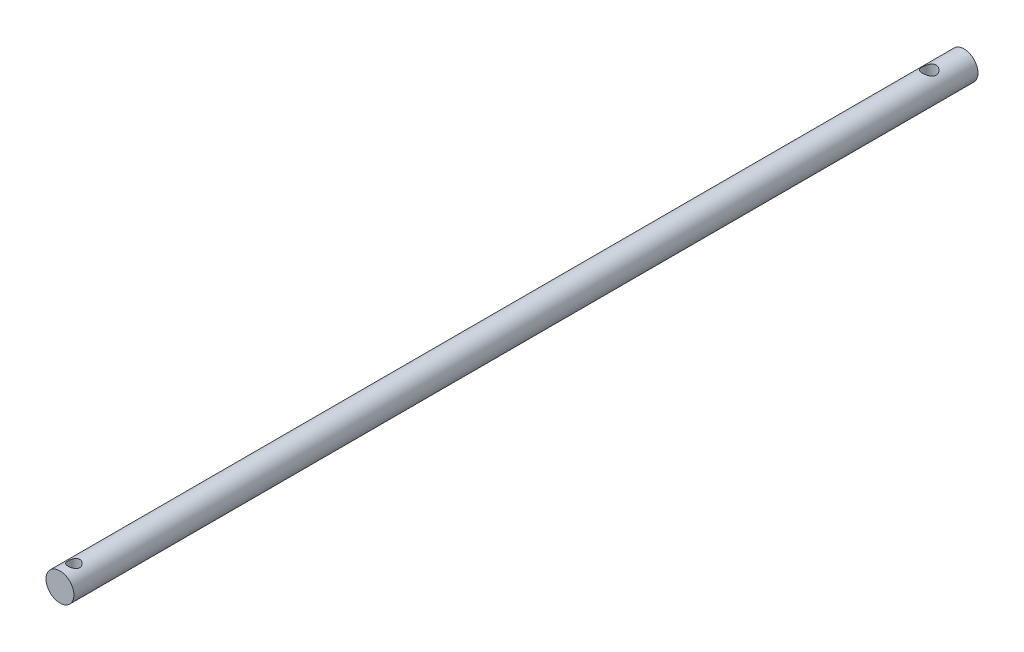
ISO-10303-21;
HEADER;
FILE_DESCRIPTION(('STEP AP214'),'2;1');
FILE_NAME('part.step','',(''),(''),'','','');
FILE_SCHEMA(('AUTOMOTIVE_DESIGN { 1 0 10303 214 1 1 1 1 }'));
ENDSEC;
DATA;
#1=APPLICATION_CONTEXT('core data for automotive mechanical design processes');
#2=APPLICATION_PROTOCOL_DEFINITION('international standard','automotive_design',2000,#1);
#3=PRODUCT_CONTEXT('',#1,'mechanical');
#4=PRODUCT('Part','Part','',(#3));
#5=PRODUCT_RELATED_PRODUCT_CATEGORY('part','',(#4));
#6=PRODUCT_DEFINITION_FORMATION('','',#4);
#7=PRODUCT_DEFINITION_CONTEXT('part definition',#1,'design');
#8=PRODUCT_DEFINITION('design','',#6,#7);
#9=PRODUCT_DEFINITION_SHAPE('','',#8);
#10=(LENGTH_UNIT() NAMED_UNIT(*) SI_UNIT(.MILLI.,.METRE.));
#11=(NAMED_UNIT(*) PLANE_ANGLE_UNIT() SI_UNIT($,.RADIAN.));
#12=(NAMED_UNIT(*) SI_UNIT($,.STERADIAN.) SOLID_ANGLE_UNIT());
#13=UNCERTAINTY_MEASURE_WITH_UNIT(LENGTH_MEASURE(1.E-05),#10,'distance_accuracy_value','');
#14=(GEOMETRIC_REPRESENTATION_CONTEXT(3) GLOBAL_UNCERTAINTY_ASSIGNED_CONTEXT((#13)) GLOBAL_UNIT_ASSIGNED_CONTEXT((#10,
#11,#12)) REPRESENTATION_CONTEXT('',''));
#15=CARTESIAN_POINT('',(0.,0.,0.));
#16=DIRECTION('',(0.,0.,1.));
#17=DIRECTION('',(1.,0.,0.));
#18=AXIS2_PLACEMENT_3D('',#15,#16,#17);
#19=CARTESIAN_POINT('',(0.,0.,259.));
#20=DIRECTION('',(0.,0.,-1.));
#21=DIRECTION('',(-1.,0.,0.));
#22=AXIS2_PLACEMENT_3D('',#19,#20,#21);
#23=CYLINDRICAL_SURFACE('',#22,4.);
#24=CARTESIAN_POINT('',(0.,-4.,256.69));
#25=CARTESIAN_POINT('',(0.0904187977378534,-3.99999236748301,256.689989901106));
#26=CARTESIAN_POINT('',(0.180974137610618,-3.99689882603683,256.682700725231));
#27=CARTESIAN_POINT('',(0.359513324239295,-3.98482238752453,256.653805453171));
#28=CARTESIAN_POINT('',(0.447489957864808,-3.97582436309426,256.632162581101));
#29=CARTESIAN_POINT('',(0.617994430443012,-3.95290460936051,256.575506843788));
#30=CARTESIAN_POINT('',(0.700539814947884,-3.93899976235193,256.54053978889));
#31=CARTESIAN_POINT('',(0.858511149356958,-3.90761479968936,256.458420045241));
#32=CARTESIAN_POINT('',(0.933939135949763,-3.89013571138923,256.411270857009));
#33=CARTESIAN_POINT('',(1.07952774502228,-3.85234213214195,256.303571367521));
#34=CARTESIAN_POINT('',(1.14927531816145,-3.83193309851281,256.242496192746));
#35=CARTESIAN_POINT('',(1.27789469821147,-3.79098272951728,256.109789019115));
#36=CARTESIAN_POINT('',(1.33676062828834,-3.77044132882458,256.038151353113));
#37=CARTESIAN_POINT('',(1.44491079202456,-3.73037948410023,255.881933511229));
#38=CARTESIAN_POINT('',(1.49355448088583,-3.71096429077667,255.796880042952));
#39=CARTESIAN_POINT('',(1.57566032710226,-3.67685815218386,255.618860214084));
#40=CARTESIAN_POINT('',(1.60913052242907,-3.66216470683064,255.525898074086));
#41=CARTESIAN_POINT('',(1.65822137924007,-3.64019193551198,255.339454704516));
#42=CARTESIAN_POINT('',(1.67463822731531,-3.63258380882292,255.246223384325));
#43=CARTESIAN_POINT('',(1.6916389519161,-3.62470066552943,255.058042889895));
#44=CARTESIAN_POINT('',(1.69223191766067,-3.62442143921493,254.963094733172));
#45=CARTESIAN_POINT('',(1.67816648000947,-3.63095018056392,254.782211572006));
#46=CARTESIAN_POINT('',(1.66471292395005,-3.63719828804049,254.696158563454));
#47=CARTESIAN_POINT('',(1.62496162231372,-3.65512928265603,254.527670462541));
#48=CARTESIAN_POINT('',(1.59866133438611,-3.66681324552159,254.445236089825));
#49=CARTESIAN_POINT('',(1.53344740790441,-3.69456536442449,254.28421346331));
#50=CARTESIAN_POINT('',(1.49427409346329,-3.71072259813572,254.205746422577));
#51=CARTESIAN_POINT('',(1.40461025505431,-3.74558141462285,254.056188693971));
#52=CARTESIAN_POINT('',(1.35411519868848,-3.76428401519589,253.985100976958));
#53=CARTESIAN_POINT('',(1.23807868093097,-3.80410788012475,253.845800653125));
#54=CARTESIAN_POINT('',(1.17160958067256,-3.825297901223,253.778378191928));
#55=CARTESIAN_POINT('',(1.02810403715588,-3.86633781546774,253.655367728628));
#56=CARTESIAN_POINT('',(0.951064985939224,-3.88618737606883,253.599782655868));
#57=CARTESIAN_POINT('',(0.786147490487138,-3.92291605594621,253.500821226993));
#58=CARTESIAN_POINT('',(0.69805086001977,-3.9397111172698,253.457774953376));
#59=CARTESIAN_POINT('',(0.514975339328132,-3.96778959195378,253.387392649354));
#60=CARTESIAN_POINT('',(0.420000397501675,-3.97907613904824,253.360047685078));
#61=CARTESIAN_POINT('',(0.232459958250167,-3.99427537725437,253.323518099692));
#62=CARTESIAN_POINT('',(0.140135702281223,-3.99861764618435,253.313273626046));
#63=CARTESIAN_POINT('',(-0.0450077112308784,-4.00081675074519,253.308065297569));
#64=CARTESIAN_POINT('',(-0.137826713349778,-3.99867551564121,253.313096897111));
#65=CARTESIAN_POINT('',(-0.316304079999673,-3.98842570699486,253.33754690452));
#66=CARTESIAN_POINT('',(-0.402085422974631,-3.98062913203958,253.356213451676));
#67=CARTESIAN_POINT('',(-0.569200242421756,-3.9601897273826,253.406348648216));
#68=CARTESIAN_POINT('',(-0.650533159504975,-3.94754628978231,253.437818903485));
#69=CARTESIAN_POINT('',(-0.809306683760339,-3.91813067285639,253.51369375295));
#70=CARTESIAN_POINT('',(-0.886547008511293,-3.90124210751331,253.55847085978));
#71=CARTESIAN_POINT('',(-1.03269506611376,-3.86512833606225,253.659280074284));
#72=CARTESIAN_POINT('',(-1.10159925960638,-3.84590214434147,253.715316935949));
#73=CARTESIAN_POINT('',(-1.23443718760681,-3.80543486846857,253.84186182083));
#74=CARTESIAN_POINT('',(-1.29763513044852,-3.78414945926641,253.913130015415));
#75=CARTESIAN_POINT('',(-1.41138831787397,-3.7432134233303,254.065585255203));
#76=CARTESIAN_POINT('',(-1.46194038421238,-3.72356320839066,254.146774786285));
#77=CARTESIAN_POINT('',(-1.54960079926505,-3.68795624343166,254.318617173841));
#78=CARTESIAN_POINT('',(-1.58648095327107,-3.67206366347157,254.409400729139));
#79=CARTESIAN_POINT('',(-1.64410901959406,-3.64663078257539,254.596774106323));
#80=CARTESIAN_POINT('',(-1.66487074169268,-3.63708504486726,254.693358881283));
#81=CARTESIAN_POINT('',(-1.68828207541125,-3.62627283049224,254.881405037026));
#82=CARTESIAN_POINT('',(-1.69222825892826,-3.62441401780231,254.972671588958));
#83=CARTESIAN_POINT('',(-1.68537785637328,-3.6276047997137,255.1545169765));
#84=CARTESIAN_POINT('',(-1.67458369192035,-3.63265325955354,255.245095922614));
#85=CARTESIAN_POINT('',(-1.63965823769036,-3.64854188176089,255.418394371892));
#86=CARTESIAN_POINT('',(-1.61620934370255,-3.6590848367316,255.501281294741));
#87=CARTESIAN_POINT('',(-1.5573177963736,-3.6845331741648,255.661957929973));
#88=CARTESIAN_POINT('',(-1.52187175339322,-3.69943978936203,255.739746194373));
#89=CARTESIAN_POINT('',(-1.43750296026302,-3.73306367433835,255.893204624675));
#90=CARTESIAN_POINT('',(-1.38788953597361,-3.75195803310328,255.96845551494));
#91=CARTESIAN_POINT('',(-1.27754679821321,-3.79094917474781,256.109969165534));
#92=CARTESIAN_POINT('',(-1.21681345812639,-3.81104639141229,256.17622865482));
#93=CARTESIAN_POINT('',(-1.08049597704433,-3.852007517481,256.303048459568));
#94=CARTESIAN_POINT('',(-1.00413525518049,-3.87281413459316,256.362796514883));
#95=CARTESIAN_POINT('',(-0.84170731443426,-3.91132777067814,256.468681050493));
#96=CARTESIAN_POINT('',(-0.755635712477166,-3.92903338071274,256.514811350071));
#97=CARTESIAN_POINT('',(-0.577463560917082,-3.95911267903729,256.59119066456));
#98=CARTESIAN_POINT('',(-0.485478199081786,-3.97156534053616,256.621676515701));
#99=CARTESIAN_POINT('',(-0.29721045608487,-3.99005502570014,256.66645346392));
#100=CARTESIAN_POINT('',(-0.200942443236266,-3.99611203103567,256.680795009287));
#101=CARTESIAN_POINT('',(-0.0695327137178608,-3.99954937588165,256.688930982124));
#102=CARTESIAN_POINT('',(-0.0347764561266262,-4.00000293558307,256.690003884189));
#103=CARTESIAN_POINT('',(0.,-4.,256.69));
#104=B_SPLINE_CURVE_WITH_KNOTS('',3,(#24,#25,#26,#27,#28,#29,#30,#31,#32,#33,#34,#35,#36,#37,
#38,#39,#40,#41,#42,#43,#44,#45,#46,#47,#48,#49,#50,#51,#52,#53,#54,#55,#56,#57,#58,#59,#60,#61,
#62,#63,#64,#65,#66,#67,#68,#69,#70,#71,#72,#73,#74,#75,#76,#77,#78,#79,#80,#81,#82,#83,#84,#85,
#86,#87,#88,#89,#90,#91,#92,#93,#94,#95,#96,#97,#98,#99,#100,#101,#102,#103),.UNSPECIFIED.,.T.,
.F.,(4,2,2,2,2,2,2,2,2,2,2,2,2,2,2,2,2,2,2,2,2,2,2,2,2,2,2,2,2,2,2,2,2,2,2,2,2,2,2,4),(0.,
0.271155352410752,0.543008135123759,0.813934563447645,1.08478322783958,1.36833684086817,
1.65204314773266,1.95019604386879,2.24819081208455,2.5315445261753,2.81473547872727,
3.07548540746323,3.3362869591733,3.60271042234599,3.86924073303779,4.15899322089027,
4.44881732931355,4.74569559637374,5.04240477516915,5.31993012353291,5.5973728981285,
5.86057213852874,6.12380440045921,6.3952398082215,6.66679006069921,6.95826732215515,
7.24981776617139,7.54603599625316,7.84200015463494,8.11467710807927,8.38730927016069,
8.64652640689924,8.90581684330839,9.18093787353902,9.45615872516712,9.75223361784434,
10.0484426847202,10.3400244401021,10.6306924992217,10.7349830057594),.UNSPECIFIED.);
#105=CARTESIAN_POINT('',(0.,-4.,256.69));
#106=VERTEX_POINT('',#105);
#107=EDGE_CURVE('E11',#106,#106,#104,.T.);
#108=ORIENTED_EDGE('',*,*,#107,.T.);
#109=EDGE_LOOP('',(#108));
#110=FACE_BOUND('',#109,.T.);
#111=CARTESIAN_POINT('',(0.,4.,256.69));
#112=CARTESIAN_POINT('',(-0.0904187977378534,3.99999236748301,256.689989901106));
#113=CARTESIAN_POINT('',(-0.180974137610618,3.99689882603683,256.682700725231));
#114=CARTESIAN_POINT('',(-0.359513324239295,3.98482238752453,256.653805453171));
#115=CARTESIAN_POINT('',(-0.447489957864808,3.97582436309426,256.632162581101));
#116=CARTESIAN_POINT('',(-0.617994430443012,3.95290460936051,256.575506843788));
#117=CARTESIAN_POINT('',(-0.700539814947884,3.93899976235193,256.54053978889));
#118=CARTESIAN_POINT('',(-0.858511149356958,3.90761479968936,256.458420045241));
#119=CARTESIAN_POINT('',(-0.933939135949763,3.89013571138923,256.411270857009));
#120=CARTESIAN_POINT('',(-1.07952774502228,3.85234213214195,256.303571367521));
#121=CARTESIAN_POINT('',(-1.14927531816145,3.83193309851281,256.242496192746));
#122=CARTESIAN_POINT('',(-1.27789469821147,3.79098272951728,256.109789019115));
#123=CARTESIAN_POINT('',(-1.33676062828834,3.77044132882458,256.038151353113));
#124=CARTESIAN_POINT('',(-1.44491079202456,3.73037948410023,255.881933511229));
#125=CARTESIAN_POINT('',(-1.49355448088583,3.71096429077667,255.796880042952));
#126=CARTESIAN_POINT('',(-1.57566032710226,3.67685815218386,255.618860214084));
#127=CARTESIAN_POINT('',(-1.60913052242907,3.66216470683064,255.525898074086));
#128=CARTESIAN_POINT('',(-1.65822137924007,3.64019193551198,255.339454704516));
#129=CARTESIAN_POINT('',(-1.67463822731531,3.63258380882292,255.246223384325));
#130=CARTESIAN_POINT('',(-1.6916389519161,3.62470066552943,255.058042889895));
#131=CARTESIAN_POINT('',(-1.69223191766067,3.62442143921493,254.963094733172));
#132=CARTESIAN_POINT('',(-1.67816648000947,3.63095018056392,254.782211572006));
#133=CARTESIAN_POINT('',(-1.66471292395005,3.63719828804049,254.696158563454));
#134=CARTESIAN_POINT('',(-1.62496162231372,3.65512928265603,254.527670462541));
#135=CARTESIAN_POINT('',(-1.59866133438611,3.66681324552159,254.445236089825));
#136=CARTESIAN_POINT('',(-1.53344740790441,3.69456536442449,254.28421346331));
#137=CARTESIAN_POINT('',(-1.49427409346329,3.71072259813572,254.205746422577));
#138=CARTESIAN_POINT('',(-1.40461025505431,3.74558141462285,254.056188693971));
#139=CARTESIAN_POINT('',(-1.35411519868848,3.76428401519589,253.985100976958));
#140=CARTESIAN_POINT('',(-1.23807868093097,3.80410788012475,253.845800653125));
#141=CARTESIAN_POINT('',(-1.17160958067256,3.825297901223,253.778378191928));
#142=CARTESIAN_POINT('',(-1.02810403715588,3.86633781546774,253.655367728628));
#143=CARTESIAN_POINT('',(-0.951064985939224,3.88618737606883,253.599782655868));
#144=CARTESIAN_POINT('',(-0.786147490487138,3.92291605594621,253.500821226993));
#145=CARTESIAN_POINT('',(-0.69805086001977,3.9397111172698,253.457774953376));
#146=CARTESIAN_POINT('',(-0.514975339328132,3.96778959195378,253.387392649354));
#147=CARTESIAN_POINT('',(-0.420000397501675,3.97907613904824,253.360047685078));
#148=CARTESIAN_POINT('',(-0.232459958250167,3.99427537725437,253.323518099692));
#149=CARTESIAN_POINT('',(-0.140135702281223,3.99861764618435,253.313273626046));
#150=CARTESIAN_POINT('',(0.0450077112308784,4.00081675074519,253.308065297569));
#151=CARTESIAN_POINT('',(0.137826713349778,3.99867551564121,253.313096897111));
#152=CARTESIAN_POINT('',(0.316304079999673,3.98842570699486,253.33754690452));
#153=CARTESIAN_POINT('',(0.402085422974631,3.98062913203958,253.356213451676));
#154=CARTESIAN_POINT('',(0.569200242421756,3.9601897273826,253.406348648216));
#155=CARTESIAN_POINT('',(0.650533159504975,3.94754628978231,253.437818903485));
#156=CARTESIAN_POINT('',(0.809306683760339,3.91813067285639,253.51369375295));
#157=CARTESIAN_POINT('',(0.886547008511293,3.90124210751331,253.55847085978));
#158=CARTESIAN_POINT('',(1.03269506611376,3.86512833606225,253.659280074284));
#159=CARTESIAN_POINT('',(1.10159925960638,3.84590214434147,253.715316935949));
#160=CARTESIAN_POINT('',(1.23443718760681,3.80543486846857,253.84186182083));
#161=CARTESIAN_POINT('',(1.29763513044852,3.78414945926641,253.913130015415));
#162=CARTESIAN_POINT('',(1.41138831787397,3.7432134233303,254.065585255203));
#163=CARTESIAN_POINT('',(1.46194038421238,3.72356320839066,254.146774786285));
#164=CARTESIAN_POINT('',(1.54960079926505,3.68795624343166,254.318617173841));
#165=CARTESIAN_POINT('',(1.58648095327107,3.67206366347157,254.409400729139));
#166=CARTESIAN_POINT('',(1.64410901959406,3.64663078257539,254.596774106323));
#167=CARTESIAN_POINT('',(1.66487074169268,3.63708504486726,254.693358881283));
#168=CARTESIAN_POINT('',(1.68828207541125,3.62627283049224,254.881405037026));
#169=CARTESIAN_POINT('',(1.69222825892826,3.62441401780231,254.972671588958));
#170=CARTESIAN_POINT('',(1.68537785637328,3.6276047997137,255.1545169765));
#171=CARTESIAN_POINT('',(1.67458369192035,3.63265325955354,255.245095922614));
#172=CARTESIAN_POINT('',(1.63965823769036,3.64854188176089,255.418394371892));
#173=CARTESIAN_POINT('',(1.61620934370255,3.6590848367316,255.501281294741));
#174=CARTESIAN_POINT('',(1.5573177963736,3.6845331741648,255.661957929973));
#175=CARTESIAN_POINT('',(1.52187175339322,3.69943978936203,255.739746194373));
#176=CARTESIAN_POINT('',(1.43750296026302,3.73306367433835,255.893204624675));
#177=CARTESIAN_POINT('',(1.38788953597361,3.75195803310328,255.96845551494));
#178=CARTESIAN_POINT('',(1.27754679821321,3.79094917474781,256.109969165534));
#179=CARTESIAN_POINT('',(1.21681345812639,3.81104639141229,256.17622865482));
#180=CARTESIAN_POINT('',(1.08049597704433,3.852007517481,256.303048459568));
#181=CARTESIAN_POINT('',(1.00413525518049,3.87281413459316,256.362796514883));
#182=CARTESIAN_POINT('',(0.84170731443426,3.91132777067814,256.468681050493));
#183=CARTESIAN_POINT('',(0.755635712477166,3.92903338071274,256.514811350071));
#184=CARTESIAN_POINT('',(0.577463560917082,3.95911267903729,256.59119066456));
#185=CARTESIAN_POINT('',(0.485478199081786,3.97156534053616,256.621676515701));
#186=CARTESIAN_POINT('',(0.29721045608487,3.99005502570014,256.66645346392));
#187=CARTESIAN_POINT('',(0.200942443236266,3.99611203103567,256.680795009287));
#188=CARTESIAN_POINT('',(0.0695327137178608,3.99954937588165,256.688930982124));
#189=CARTESIAN_POINT('',(0.0347764561266262,4.00000293558307,256.690003884189));
#190=CARTESIAN_POINT('',(0.,4.,256.69));
#191=B_SPLINE_CURVE_WITH_KNOTS('',3,(#111,#112,#113,#114,#115,#116,#117,#118,#119,#120,#121,
#122,#123,#124,#125,#126,#127,#128,#129,#130,#131,#132,#133,#134,#135,#136,#137,#138,#139,#140,
#141,#142,#143,#144,#145,#146,#147,#148,#149,#150,#151,#152,#153,#154,#155,#156,#157,#158,#159,
#160,#161,#162,#163,#164,#165,#166,#167,#168,#169,#170,#171,#172,#173,#174,#175,#176,#177,#178,
#179,#180,#181,#182,#183,#184,#185,#186,#187,#188,#189,#190),.UNSPECIFIED.,.T.,.F.,(4,2,2,2,2,2,
2,2,2,2,2,2,2,2,2,2,2,2,2,2,2,2,2,2,2,2,2,2,2,2,2,2,2,2,2,2,2,2,2,4),(0.,0.271155352410752,
0.543008135123759,0.813934563447645,1.08478322783958,1.36833684086817,1.65204314773266,
1.95019604386879,2.24819081208455,2.5315445261753,2.81473547872727,3.07548540746323,
3.3362869591733,3.60271042234599,3.86924073303779,4.15899322089027,4.44881732931355,
4.74569559637374,5.04240477516915,5.31993012353291,5.5973728981285,5.86057213852874,
6.12380440045921,6.3952398082215,6.66679006069921,6.95826732215515,7.24981776617139,
7.54603599625316,7.84200015463494,8.11467710807927,8.38730927016069,8.64652640689924,
8.90581684330839,9.18093787353902,9.45615872516712,9.75223361784434,10.0484426847202,
10.3400244401021,10.6306924992217,10.7349830057594),.UNSPECIFIED.);
#192=CARTESIAN_POINT('',(0.,4.,256.69));
#193=VERTEX_POINT('',#192);
#194=EDGE_CURVE('E40',#193,#193,#191,.T.);
#195=ORIENTED_EDGE('',*,*,#194,.T.);
#196=EDGE_LOOP('',(#195));
#197=FACE_BOUND('',#196,.T.);
#198=CARTESIAN_POINT('',(0.,4.,12.));
#199=CARTESIAN_POINT('',(-0.105143925902467,3.99999426810082,11.9999933953656));
#200=CARTESIAN_POINT('',(-0.210413199395124,3.99580982039513,11.9916598537579));
#201=CARTESIAN_POINT('',(-0.417840470537791,3.97948312074314,11.9586942393169));
#202=CARTESIAN_POINT('',(-0.519992173427258,3.96732575657839,11.9340312140044));
#203=CARTESIAN_POINT('',(-0.717867089760896,3.93632558806751,11.8696123827667));
#204=CARTESIAN_POINT('',(-0.813613605878291,3.91750878355075,11.8299152315041));
#205=CARTESIAN_POINT('',(-0.996945233613195,3.87491553031523,11.73685875727));
#206=CARTESIAN_POINT('',(-1.08453098798012,3.85113947267051,11.6835005115023));
#207=CARTESIAN_POINT('',(-1.25501563552382,3.79912516516124,11.5609655010294));
#208=CARTESIAN_POINT('',(-1.33731042224421,3.77070398255074,11.4910270415207));
#209=CARTESIAN_POINT('',(-1.48955888973396,3.71319940493486,11.3389570415059));
#210=CARTESIAN_POINT('',(-1.55950316621353,3.68411552418069,11.2568162964551));
#211=CARTESIAN_POINT('',(-1.69050400090055,3.62597902394695,11.0750333009532));
#212=CARTESIAN_POINT('',(-1.75045067110327,3.59710373940264,10.9745278033082));
#213=CARTESIAN_POINT('',(-1.85233645378139,3.54571957544641,10.7632653280276));
#214=CARTESIAN_POINT('',(-1.89428842993266,3.52320615213979,10.6525157425545));
#215=CARTESIAN_POINT('',(-1.95626488437717,3.48915734075617,10.4306697891562));
#216=CARTESIAN_POINT('',(-1.97745171416088,3.47704543167427,10.3199910958652));
#217=CARTESIAN_POINT('',(-2.00085398661769,3.46363779897056,10.096042324441));
#218=CARTESIAN_POINT('',(-2.00308817674614,3.46233138686576,9.98277491825769));
#219=CARTESIAN_POINT('',(-1.98937457434459,3.47021860514497,9.77142795136927));
#220=CARTESIAN_POINT('',(-1.97556911907364,3.47817527324027,9.6731519375539));
#221=CARTESIAN_POINT('',(-1.93387969811386,3.50152457467701,9.48055618125392));
#222=CARTESIAN_POINT('',(-1.9059912477953,3.51691957663553,9.38623770938937));
#223=CARTESIAN_POINT('',(-1.836419560772,3.55374952825482,9.20154173486868));
#224=CARTESIAN_POINT('',(-1.79443013423199,3.57531681327997,9.11130720242842));
#225=CARTESIAN_POINT('',(-1.698083375336,3.62206808562807,8.93873141481999));
#226=CARTESIAN_POINT('',(-1.64372048762493,3.64725369560381,8.85639372879982));
#227=CARTESIAN_POINT('',(-1.51613210982557,3.70226315806572,8.69095749451355));
#228=CARTESIAN_POINT('',(-1.44138891673856,3.73227020473492,8.60908625284769));
#229=CARTESIAN_POINT('',(-1.27911115748274,3.79095246600815,8.4585291628182));
#230=CARTESIAN_POINT('',(-1.19157051314857,3.81962703917602,8.38984961593224));
#231=CARTESIAN_POINT('',(-1.00103301166369,3.87403974565928,8.26462867794055));
#232=CARTESIAN_POINT('',(-0.897507183198815,3.89957968324015,8.20879905510852));
#233=CARTESIAN_POINT('',(-0.680932430977592,3.94315762242485,8.11580594191398));
#234=CARTESIAN_POINT('',(-0.567891152530551,3.96120157887106,8.07862762996967));
#235=CARTESIAN_POINT('',(-0.345532983321405,3.98648667482871,8.02704919256665));
#236=CARTESIAN_POINT('',(-0.236683061096653,3.9944987660262,8.01101752850644));
#237=CARTESIAN_POINT('',(-0.0175591998987037,4.00146026918207,7.99707053773103));
#238=CARTESIAN_POINT('',(0.0927140397398169,4.00041397442637,7.99914662872107));
#239=CARTESIAN_POINT('',(0.302465943971973,3.9898238450687,8.02041337683749));
#240=CARTESIAN_POINT('',(0.402118816099859,3.98094491376337,8.03826506545999));
#241=CARTESIAN_POINT('',(0.596813784603881,3.95644342629681,8.08847614379025));
#242=CARTESIAN_POINT('',(0.691855371382173,3.94082012668824,8.12083713290699));
#243=CARTESIAN_POINT('',(0.877777216899144,3.90368502827176,8.19999693286607));
#244=CARTESIAN_POINT('',(0.968460794011605,3.88201763539262,8.24718210023258));
#245=CARTESIAN_POINT('',(1.14092272339854,3.83487948634835,8.35421507129314));
#246=CARTESIAN_POINT('',(1.22269725955318,3.80940711133877,8.41406826919079));
#247=CARTESIAN_POINT('',(1.38353537857843,3.75416442672396,8.55152085066143));
#248=CARTESIAN_POINT('',(1.46154415563805,3.72421769686998,8.6302857368903));
#249=CARTESIAN_POINT('',(1.60371264223771,3.6652478321764,8.79985030255546));
#250=CARTESIAN_POINT('',(1.66786277142374,3.63622534800094,8.89065823769584));
#251=CARTESIAN_POINT('',(1.78341582895803,3.58102384412979,9.08728730834595));
#252=CARTESIAN_POINT('',(1.83405099160049,3.55505059178122,9.19362253218896));
#253=CARTESIAN_POINT('',(1.9161656518694,3.5114814458827,9.41502013514993));
#254=CARTESIAN_POINT('',(1.94766983173403,3.493874764435,9.53007105293378));
#255=CARTESIAN_POINT('',(1.98772337493374,3.47123002051604,9.75382044576941));
#256=CARTESIAN_POINT('',(1.9981859928109,3.4651476693013,9.86206850687048));
#257=CARTESIAN_POINT('',(2.0013783087524,3.46330709283207,10.078894134329));
#258=CARTESIAN_POINT('',(1.99411569324648,3.4675443925278,10.1874715374757));
#259=CARTESIAN_POINT('',(1.96385225118662,3.48475724102153,10.3909670030669));
#260=CARTESIAN_POINT('',(1.94241662868606,3.49686188965317,10.4862009402895));
#261=CARTESIAN_POINT('',(1.88635071644882,3.52742032375305,10.6716162388487));
#262=CARTESIAN_POINT('',(1.85171618231984,3.54587615139337,10.7617959641841));
#263=CARTESIAN_POINT('',(1.76763149060113,3.58857060729071,10.9412497019731));
#264=CARTESIAN_POINT('',(1.7173422756314,3.61311444791841,11.0300558036581));
#265=CARTESIAN_POINT('',(1.60430194327478,3.66470663269721,11.1985490723625));
#266=CARTESIAN_POINT('',(1.54154434248312,3.69175627591221,11.2782314610422));
#267=CARTESIAN_POINT('',(1.39640665332274,3.74924646316184,11.4362839647093));
#268=CARTESIAN_POINT('',(1.31256884599452,3.77969966613256,11.5133182047006));
#269=CARTESIAN_POINT('',(1.13230961246639,3.83755504519861,11.6525259668705));
#270=CARTESIAN_POINT('',(1.03588144661039,3.8649555725239,11.7146914789398));
#271=CARTESIAN_POINT('',(0.831863193565889,3.91396019133075,11.8224727254241));
#272=CARTESIAN_POINT('',(0.724199007553459,3.93552192987866,11.8679683384729));
#273=CARTESIAN_POINT('',(0.501484202276171,3.97002682597974,11.9396163355148));
#274=CARTESIAN_POINT('',(0.386455599178198,3.98299446726136,11.9658236936114));
#275=CARTESIAN_POINT('',(0.225203892981788,3.99390923826956,11.9877948221715));
#276=CARTESIAN_POINT('',(0.180323758883128,3.99618730680502,11.9923652817327));
#277=CARTESIAN_POINT('',(0.0903034636101822,3.99923393953631,11.9984693310282));
#278=CARTESIAN_POINT('',(0.0451632952932564,4.00000246206762,12.0000028369404));
#279=CARTESIAN_POINT('',(0.,4.,12.));
#280=B_SPLINE_CURVE_WITH_KNOTS('',3,(#198,#199,#200,#201,#202,#203,#204,#205,#206,#207,#208,
#209,#210,#211,#212,#213,#214,#215,#216,#217,#218,#219,#220,#221,#222,#223,#224,#225,#226,#227,
#228,#229,#230,#231,#232,#233,#234,#235,#236,#237,#238,#239,#240,#241,#242,#243,#244,#245,#246,
#247,#248,#249,#250,#251,#252,#253,#254,#255,#256,#257,#258,#259,#260,#261,#262,#263,#264,#265,
#266,#267,#268,#269,#270,#271,#272,#273,#274,#275,#276,#277,#278,#279),.UNSPECIFIED.,.T.,.F.,(4,
2,2,2,2,2,2,2,2,2,2,2,2,2,2,2,2,2,2,2,2,2,2,2,2,2,2,2,2,2,2,2,2,2,2,2,2,2,2,2,4),(0.,
0.315248514840584,0.631096299418394,0.945724310984594,1.26032752116313,1.59396351743617,
1.92785247530807,2.28763452861505,2.64715895796561,2.98516024280459,3.3228271465804,
3.6201142481864,3.91749607851356,4.22180480336974,4.52625042520443,4.86929882667756,
5.21251069197372,5.5716604442888,5.93052433824558,6.2596658094269,6.58865129022951,
6.89213813012242,7.19565843261862,7.50785712055796,7.82018901496677,8.16319221288836,
8.50643177230862,8.8662936432345,9.225690238909,9.55058615006092,9.87534119729355,
10.1691586049771,10.463070575767,10.7767291356057,11.0905512228726,11.4425048551434,
11.7946476676249,12.1492802732705,12.502898172423,12.6383056026783,12.7737167702213),.UNSPECIFIED.);
#281=CARTESIAN_POINT('',(0.,4.,12.));
#282=VERTEX_POINT('',#281);
#283=EDGE_CURVE('E67',#282,#282,#280,.T.);
#284=ORIENTED_EDGE('',*,*,#283,.T.);
#285=EDGE_LOOP('',(#284));
#286=FACE_BOUND('',#285,.T.);
#287=CARTESIAN_POINT('',(0.,0.,259.));
#288=DIRECTION('',(0.,0.,1.));
#289=DIRECTION('',(1.,0.,0.));
#290=AXIS2_PLACEMENT_3D('',#287,#288,#289);
#291=CIRCLE('',#290,4.);
#292=CARTESIAN_POINT('',(4.,0.,259.));
#293=VERTEX_POINT('',#292);
#294=EDGE_CURVE('E64',#293,#293,#291,.T.);
#295=ORIENTED_EDGE('',*,*,#294,.F.);
#296=EDGE_LOOP('',(#295));
#297=FACE_BOUND('',#296,.T.);
#298=CARTESIAN_POINT('',(0.,0.,0.));
#299=DIRECTION('',(0.,0.,1.));
#300=DIRECTION('',(1.,0.,0.));
#301=AXIS2_PLACEMENT_3D('',#298,#299,#300);
#302=CIRCLE('',#301,4.);
#303=CARTESIAN_POINT('',(4.,0.,0.));
#304=VERTEX_POINT('',#303);
#305=EDGE_CURVE('E61',#304,#304,#302,.T.);
#306=ORIENTED_EDGE('',*,*,#305,.T.);
#307=EDGE_LOOP('',(#306));
#308=FACE_BOUND('',#307,.T.);
#309=ADVANCED_FACE('F30',(#110,#197,#286,#297,#308),#23,.T.);
#310=CARTESIAN_POINT('',(0.,0.,259.));
#311=DIRECTION('',(0.,0.,1.));
#312=DIRECTION('',(1.,0.,0.));
#313=AXIS2_PLACEMENT_3D('',#310,#311,#312);
#314=PLANE('',#313);
#315=ORIENTED_EDGE('',*,*,#294,.T.);
#316=EDGE_LOOP('',(#315));
#317=FACE_BOUND('',#316,.T.);
#318=ADVANCED_FACE('F84',(#317),#314,.T.);
#319=CARTESIAN_POINT('',(0.,0.,0.));
#320=DIRECTION('',(0.,0.,1.));
#321=DIRECTION('',(1.,0.,0.));
#322=AXIS2_PLACEMENT_3D('',#319,#320,#321);
#323=PLANE('',#322);
#324=ORIENTED_EDGE('',*,*,#305,.F.);
#325=EDGE_LOOP('',(#324));
#326=FACE_BOUND('',#325,.T.);
#327=ADVANCED_FACE('F80',(#326),#323,.F.);
#328=CARTESIAN_POINT('',(0.,4.,10.));
#329=DIRECTION('',(0.,1.,0.));
#330=DIRECTION('',(0.,0.,1.));
#331=AXIS2_PLACEMENT_3D('',#328,#329,#330);
#332=CYLINDRICAL_SURFACE('',#331,2.);
#333=CARTESIAN_POINT('',(0.,0.,10.));
#334=DIRECTION('',(0.,1.,0.));
#335=DIRECTION('',(0.,0.,1.));
#336=AXIS2_PLACEMENT_3D('',#333,#334,#335);
#337=CIRCLE('',#336,2.);
#338=CARTESIAN_POINT('',(0.,0.,12.));
#339=VERTEX_POINT('',#338);
#340=EDGE_CURVE('E56',#339,#339,#337,.T.);
#341=ORIENTED_EDGE('',*,*,#340,.F.);
#342=EDGE_LOOP('',(#341));
#343=FACE_BOUND('',#342,.T.);
#344=ORIENTED_EDGE('',*,*,#283,.F.);
#345=EDGE_LOOP('',(#344));
#346=FACE_BOUND('',#345,.T.);
#347=ADVANCED_FACE('F74',(#343,#346),#332,.F.);
#348=CARTESIAN_POINT('',(1.65,0.,10.));
#349=DIRECTION('',(0.,-1.,0.));
#350=DIRECTION('',(0.,0.,-1.));
#351=AXIS2_PLACEMENT_3D('',#348,#349,#350);
#352=PLANE('',#351);
#353=CARTESIAN_POINT('',(0.,0.,10.));
#354=DIRECTION('',(0.,1.,0.));
#355=DIRECTION('',(0.,0.,1.));
#356=AXIS2_PLACEMENT_3D('',#353,#354,#355);
#357=CIRCLE('',#356,1.65);
#358=CARTESIAN_POINT('',(0.,0.,11.65));
#359=VERTEX_POINT('',#358);
#360=EDGE_CURVE('E53',#359,#359,#357,.T.);
#361=ORIENTED_EDGE('',*,*,#360,.F.);
#362=EDGE_LOOP('',(#361));
#363=FACE_BOUND('',#362,.T.);
#364=ORIENTED_EDGE('',*,*,#340,.T.);
#365=EDGE_LOOP('',(#364));
#366=FACE_BOUND('',#365,.T.);
#367=ADVANCED_FACE('F79',(#363,#366),#352,.F.);
#368=CARTESIAN_POINT('',(0.,4.,10.));
#369=DIRECTION('',(0.,1.,0.));
#370=DIRECTION('',(0.,0.,1.));
#371=AXIS2_PLACEMENT_3D('',#368,#369,#370);
#372=CYLINDRICAL_SURFACE('',#371,1.65);
#373=CARTESIAN_POINT('',(0.,-2.1,10.));
#374=DIRECTION('',(0.,1.,0.));
#375=DIRECTION('',(0.,0.,1.));
#376=AXIS2_PLACEMENT_3D('',#373,#374,#375);
#377=CIRCLE('',#376,1.65);
#378=CARTESIAN_POINT('',(0.,-2.1,11.65));
#379=VERTEX_POINT('',#378);
#380=EDGE_CURVE('E51',#379,#379,#377,.T.);
#381=ORIENTED_EDGE('',*,*,#380,.F.);
#382=EDGE_LOOP('',(#381));
#383=FACE_BOUND('',#382,.T.);
#384=ORIENTED_EDGE('',*,*,#360,.T.);
#385=EDGE_LOOP('',(#384));
#386=FACE_BOUND('',#385,.T.);
#387=ADVANCED_FACE('F47',(#383,#386),#372,.F.);
#388=CARTESIAN_POINT('',(0.,-2.1,10.));
#389=DIRECTION('',(0.,1.,0.));
#390=DIRECTION('',(0.,0.,1.));
#391=AXIS2_PLACEMENT_3D('',#388,#389,#390);
#392=CONICAL_SURFACE('',#391,1.65,1.02974425867665);
#393=CARTESIAN_POINT('',(0.,-3.09142002139547,10.));
#394=VERTEX_POINT('',#393);
#395=VERTEX_LOOP('',#394);
#396=FACE_BOUND('',#395,.T.);
#397=ORIENTED_EDGE('',*,*,#380,.T.);
#398=EDGE_LOOP('',(#397));
#399=FACE_BOUND('',#398,.T.);
#400=ADVANCED_FACE('F43',(#396,#399),#392,.F.);
#401=CARTESIAN_POINT('',(0.,-4.,255.));
#402=DIRECTION('',(0.,1.,0.));
#403=DIRECTION('',(0.,0.,1.));
#404=AXIS2_PLACEMENT_3D('',#401,#402,#403);
#405=CYLINDRICAL_SURFACE('',#404,1.69);
#406=ORIENTED_EDGE('',*,*,#194,.F.);
#407=EDGE_LOOP('',(#406));
#408=FACE_BOUND('',#407,.T.);
#409=ORIENTED_EDGE('',*,*,#107,.F.);
#410=EDGE_LOOP('',(#409));
#411=FACE_BOUND('',#410,.T.);
#412=ADVANCED_FACE('F46',(#408,#411),#405,.F.);
#413=CLOSED_SHELL('',(#309,#318,#327,#347,#367,#387,#400,#412));
#414=MANIFOLD_SOLID_BREP('B2',#413);
#415=ADVANCED_BREP_SHAPE_REPRESENTATION('',(#18,#414),#14);
#416=SHAPE_DEFINITION_REPRESENTATION(#9,#415);
ENDSEC;
END-ISO-10303-21;
